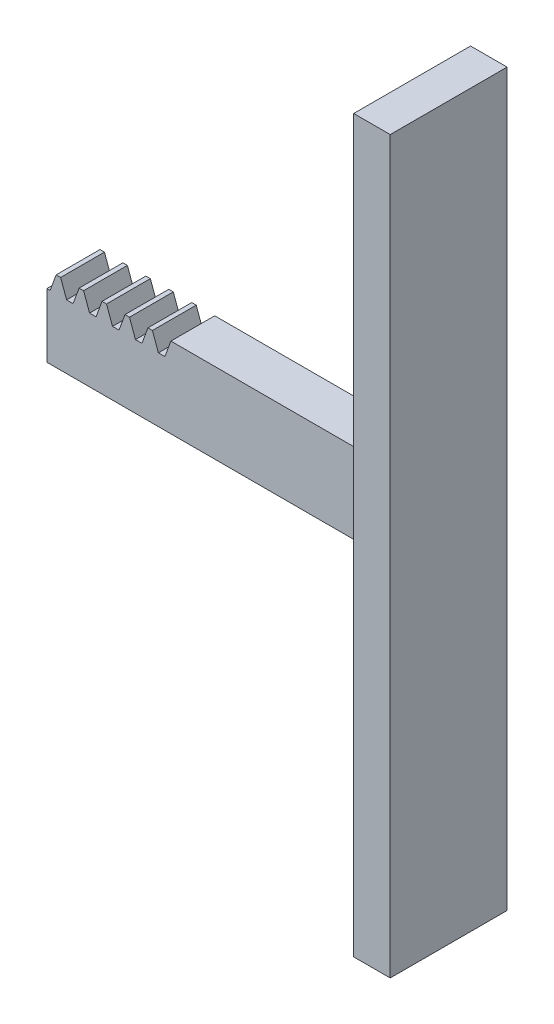
ISO-10303-21;
HEADER;
FILE_DESCRIPTION(('STEP AP214'),'2;1');
FILE_NAME('part.step','',(''),(''),'','','');
FILE_SCHEMA(('AUTOMOTIVE_DESIGN { 1 0 10303 214 1 1 1 1 }'));
ENDSEC;
DATA;
#1=APPLICATION_CONTEXT('core data for automotive mechanical design processes');
#2=APPLICATION_PROTOCOL_DEFINITION('international standard','automotive_design',2000,#1);
#3=PRODUCT_CONTEXT('',#1,'mechanical');
#4=PRODUCT('Part','Part','',(#3));
#5=PRODUCT_RELATED_PRODUCT_CATEGORY('part','',(#4));
#6=PRODUCT_DEFINITION_FORMATION('','',#4);
#7=PRODUCT_DEFINITION_CONTEXT('part definition',#1,'design');
#8=PRODUCT_DEFINITION('design','',#6,#7);
#9=PRODUCT_DEFINITION_SHAPE('','',#8);
#10=(LENGTH_UNIT() NAMED_UNIT(*) SI_UNIT(.MILLI.,.METRE.));
#11=(NAMED_UNIT(*) PLANE_ANGLE_UNIT() SI_UNIT($,.RADIAN.));
#12=(NAMED_UNIT(*) SI_UNIT($,.STERADIAN.) SOLID_ANGLE_UNIT());
#13=UNCERTAINTY_MEASURE_WITH_UNIT(LENGTH_MEASURE(1.E-05),#10,'distance_accuracy_value','');
#14=(GEOMETRIC_REPRESENTATION_CONTEXT(3) GLOBAL_UNCERTAINTY_ASSIGNED_CONTEXT((#13)) GLOBAL_UNIT_ASSIGNED_CONTEXT((#10,
#11,#12)) REPRESENTATION_CONTEXT('',''));
#15=CARTESIAN_POINT('',(0.,0.,0.));
#16=DIRECTION('',(0.,0.,1.));
#17=DIRECTION('',(1.,0.,0.));
#18=AXIS2_PLACEMENT_3D('',#15,#16,#17);
#19=CARTESIAN_POINT('',(0.,11.,-6.));
#20=DIRECTION('',(0.,1.,0.));
#21=DIRECTION('',(0.,0.,1.));
#22=AXIS2_PLACEMENT_3D('',#19,#20,#21);
#23=PLANE('',#22);
#24=DIRECTION('',(0.,0.,1.));
#25=VECTOR('',#24,1.);
#26=CARTESIAN_POINT('',(14.4445948532338,11.,-6.));
#27=LINE('',#26,#25);
#28=CARTESIAN_POINT('',(14.4445948532338,11.,-6.));
#29=VERTEX_POINT('',#28);
#30=CARTESIAN_POINT('',(14.4445948532338,11.,0.));
#31=VERTEX_POINT('',#30);
#32=EDGE_CURVE('E315',#29,#31,#27,.T.);
#33=ORIENTED_EDGE('',*,*,#32,.F.);
#34=DIRECTION('',(-1.,0.,0.));
#35=VECTOR('',#34,1.);
#36=CARTESIAN_POINT('',(0.,11.,-6.));
#37=LINE('',#36,#35);
#38=CARTESIAN_POINT('',(13.8297389967662,11.,-6.));
#39=VERTEX_POINT('',#38);
#40=EDGE_CURVE('E485',#29,#39,#37,.T.);
#41=ORIENTED_EDGE('',*,*,#40,.T.);
#42=DIRECTION('',(0.,0.,-1.));
#43=VECTOR('',#42,1.);
#44=CARTESIAN_POINT('',(13.8297389967662,11.,-6.));
#45=LINE('',#44,#43);
#46=CARTESIAN_POINT('',(13.8297389967662,11.,0.));
#47=VERTEX_POINT('',#46);
#48=EDGE_CURVE('E340',#47,#39,#45,.T.);
#49=ORIENTED_EDGE('',*,*,#48,.F.);
#50=DIRECTION('',(-1.,0.,0.));
#51=VECTOR('',#50,1.);
#52=CARTESIAN_POINT('',(0.,11.,0.));
#53=LINE('',#52,#51);
#54=EDGE_CURVE('E495',#31,#47,#53,.T.);
#55=ORIENTED_EDGE('',*,*,#54,.F.);
#56=EDGE_LOOP('',(#33,#41,#49,#55));
#57=FACE_BOUND('',#56,.T.);
#58=ADVANCED_FACE('F39',(#57),#23,.T.);
#59=DIRECTION('',(0.,0.,1.));
#60=VECTOR('',#59,1.);
#61=CARTESIAN_POINT('',(11.3030022032338,11.,-6.));
#62=LINE('',#61,#60);
#63=CARTESIAN_POINT('',(11.3030022032338,11.,-6.));
#64=VERTEX_POINT('',#63);
#65=CARTESIAN_POINT('',(11.3030022032338,11.,0.));
#66=VERTEX_POINT('',#65);
#67=EDGE_CURVE('E346',#64,#66,#62,.T.);
#68=ORIENTED_EDGE('',*,*,#67,.F.);
#69=CARTESIAN_POINT('',(10.6881463467662,11.,-6.));
#70=VERTEX_POINT('',#69);
#71=EDGE_CURVE('E563',#64,#70,#37,.T.);
#72=ORIENTED_EDGE('',*,*,#71,.T.);
#73=DIRECTION('',(0.,0.,-1.));
#74=VECTOR('',#73,1.);
#75=CARTESIAN_POINT('',(10.6881463467662,11.,-6.));
#76=LINE('',#75,#74);
#77=CARTESIAN_POINT('',(10.6881463467662,11.,0.));
#78=VERTEX_POINT('',#77);
#79=EDGE_CURVE('E373',#78,#70,#76,.T.);
#80=ORIENTED_EDGE('',*,*,#79,.F.);
#81=EDGE_CURVE('E522',#66,#78,#53,.T.);
#82=ORIENTED_EDGE('',*,*,#81,.F.);
#83=EDGE_LOOP('',(#68,#72,#80,#82));
#84=FACE_BOUND('',#83,.T.);
#85=ADVANCED_FACE('F528',(#84),#23,.T.);
#86=DIRECTION('',(0.,0.,1.));
#87=VECTOR('',#86,1.);
#88=CARTESIAN_POINT('',(8.1614095532338,11.,-6.));
#89=LINE('',#88,#87);
#90=CARTESIAN_POINT('',(8.1614095532338,11.,-6.));
#91=VERTEX_POINT('',#90);
#92=CARTESIAN_POINT('',(8.1614095532338,11.,0.));
#93=VERTEX_POINT('',#92);
#94=EDGE_CURVE('E379',#91,#93,#89,.T.);
#95=ORIENTED_EDGE('',*,*,#94,.F.);
#96=CARTESIAN_POINT('',(7.5465536967662,11.,-6.));
#97=VERTEX_POINT('',#96);
#98=EDGE_CURVE('E557',#91,#97,#37,.T.);
#99=ORIENTED_EDGE('',*,*,#98,.T.);
#100=DIRECTION('',(0.,0.,-1.));
#101=VECTOR('',#100,1.);
#102=CARTESIAN_POINT('',(7.5465536967662,11.,-6.));
#103=LINE('',#102,#101);
#104=CARTESIAN_POINT('',(7.5465536967662,11.,0.));
#105=VERTEX_POINT('',#104);
#106=EDGE_CURVE('E406',#105,#97,#103,.T.);
#107=ORIENTED_EDGE('',*,*,#106,.F.);
#108=EDGE_CURVE('E531',#93,#105,#53,.T.);
#109=ORIENTED_EDGE('',*,*,#108,.F.);
#110=EDGE_LOOP('',(#95,#99,#107,#109));
#111=FACE_BOUND('',#110,.T.);
#112=ADVANCED_FACE('F624',(#111),#23,.T.);
#113=DIRECTION('',(0.,0.,1.));
#114=VECTOR('',#113,1.);
#115=CARTESIAN_POINT('',(5.0198169032338,11.,-6.));
#116=LINE('',#115,#114);
#117=CARTESIAN_POINT('',(5.0198169032338,11.,-6.));
#118=VERTEX_POINT('',#117);
#119=CARTESIAN_POINT('',(5.0198169032338,11.,0.));
#120=VERTEX_POINT('',#119);
#121=EDGE_CURVE('E412',#118,#120,#116,.T.);
#122=ORIENTED_EDGE('',*,*,#121,.F.);
#123=CARTESIAN_POINT('',(4.4049610467662,11.,-6.));
#124=VERTEX_POINT('',#123);
#125=EDGE_CURVE('E555',#118,#124,#37,.T.);
#126=ORIENTED_EDGE('',*,*,#125,.T.);
#127=DIRECTION('',(0.,0.,-1.));
#128=VECTOR('',#127,1.);
#129=CARTESIAN_POINT('',(4.4049610467662,11.,-6.));
#130=LINE('',#129,#128);
#131=CARTESIAN_POINT('',(4.4049610467662,11.,0.));
#132=VERTEX_POINT('',#131);
#133=EDGE_CURVE('E439',#132,#124,#130,.T.);
#134=ORIENTED_EDGE('',*,*,#133,.F.);
#135=EDGE_CURVE('E534',#120,#132,#53,.T.);
#136=ORIENTED_EDGE('',*,*,#135,.F.);
#137=EDGE_LOOP('',(#122,#126,#134,#136));
#138=FACE_BOUND('',#137,.T.);
#139=ADVANCED_FACE('F632',(#138),#23,.T.);
#140=DIRECTION('',(0.,0.,1.));
#141=VECTOR('',#140,1.);
#142=CARTESIAN_POINT('',(1.8782242532338,11.,-6.));
#143=LINE('',#142,#141);
#144=CARTESIAN_POINT('',(1.8782242532338,11.,-6.));
#145=VERTEX_POINT('',#144);
#146=CARTESIAN_POINT('',(1.8782242532338,11.,0.));
#147=VERTEX_POINT('',#146);
#148=EDGE_CURVE('E445',#145,#147,#143,.T.);
#149=ORIENTED_EDGE('',*,*,#148,.F.);
#150=CARTESIAN_POINT('',(1.2633683967662,11.,-6.));
#151=VERTEX_POINT('',#150);
#152=EDGE_CURVE('E479',#145,#151,#37,.T.);
#153=ORIENTED_EDGE('',*,*,#152,.T.);
#154=DIRECTION('',(0.,0.,-1.));
#155=VECTOR('',#154,1.);
#156=CARTESIAN_POINT('',(1.2633683967662,11.,-6.));
#157=LINE('',#156,#155);
#158=CARTESIAN_POINT('',(1.2633683967662,11.,0.));
#159=VERTEX_POINT('',#158);
#160=EDGE_CURVE('E467',#159,#151,#157,.T.);
#161=ORIENTED_EDGE('',*,*,#160,.F.);
#162=EDGE_CURVE('E491',#147,#159,#53,.T.);
#163=ORIENTED_EDGE('',*,*,#162,.F.);
#164=EDGE_LOOP('',(#149,#153,#161,#163));
#165=FACE_BOUND('',#164,.T.);
#166=ADVANCED_FACE('F551',(#165),#23,.T.);
#167=CARTESIAN_POINT('',(0.,0.,-6.));
#168=DIRECTION('',(-1.,0.,0.));
#169=DIRECTION('',(0.,0.,1.));
#170=AXIS2_PLACEMENT_3D('',#167,#168,#169);
#171=PLANE('',#170);
#172=DIRECTION('',(0.,0.,1.));
#173=VECTOR('',#172,1.);
#174=CARTESIAN_POINT('',(0.,8.75,-6.));
#175=LINE('',#174,#173);
#176=CARTESIAN_POINT('',(0.,8.75,-6.));
#177=VERTEX_POINT('',#176);
#178=CARTESIAN_POINT('',(0.,8.75,0.));
#179=VERTEX_POINT('',#178);
#180=EDGE_CURVE('E464',#177,#179,#175,.T.);
#181=ORIENTED_EDGE('',*,*,#180,.F.);
#182=DIRECTION('',(0.,-1.,0.));
#183=VECTOR('',#182,1.);
#184=CARTESIAN_POINT('',(0.,0.,-6.));
#185=LINE('',#184,#183);
#186=CARTESIAN_POINT('',(0.,0.,-6.));
#187=VERTEX_POINT('',#186);
#188=EDGE_CURVE('E472',#177,#187,#185,.T.);
#189=ORIENTED_EDGE('',*,*,#188,.T.);
#190=DIRECTION('',(0.,0.,1.));
#191=VECTOR('',#190,1.);
#192=CARTESIAN_POINT('',(0.,0.,-6.));
#193=LINE('',#192,#191);
#194=CARTESIAN_POINT('',(0.,0.,0.));
#195=VERTEX_POINT('',#194);
#196=EDGE_CURVE('E484',#187,#195,#193,.T.);
#197=ORIENTED_EDGE('',*,*,#196,.T.);
#198=DIRECTION('',(0.,-1.,0.));
#199=VECTOR('',#198,1.);
#200=CARTESIAN_POINT('',(0.,0.,0.));
#201=LINE('',#200,#199);
#202=EDGE_CURVE('E471',#179,#195,#201,.T.);
#203=ORIENTED_EDGE('',*,*,#202,.F.);
#204=EDGE_LOOP('',(#181,#189,#197,#203));
#205=FACE_BOUND('',#204,.T.);
#206=ADVANCED_FACE('F41',(#205),#171,.T.);
#207=DIRECTION('',(0.,0.,-1.));
#208=VECTOR('',#207,1.);
#209=CARTESIAN_POINT('',(16.9713316467662,11.,-6.));
#210=LINE('',#209,#208);
#211=CARTESIAN_POINT('',(16.9713316467662,11.,0.));
#212=VERTEX_POINT('',#211);
#213=CARTESIAN_POINT('',(16.9713316467662,11.,-6.));
#214=VERTEX_POINT('',#213);
#215=EDGE_CURVE('E310',#212,#214,#210,.T.);
#216=ORIENTED_EDGE('',*,*,#215,.F.);
#217=CARTESIAN_POINT('',(47.,11.,0.));
#218=VERTEX_POINT('',#217);
#219=EDGE_CURVE('E476',#218,#212,#53,.T.);
#220=ORIENTED_EDGE('',*,*,#219,.F.);
#221=DIRECTION('',(0.,0.,1.));
#222=VECTOR('',#221,1.);
#223=CARTESIAN_POINT('',(47.,11.,0.));
#224=LINE('',#223,#222);
#225=CARTESIAN_POINT('',(47.,11.,-6.));
#226=VERTEX_POINT('',#225);
#227=EDGE_CURVE('E285',#226,#218,#224,.T.);
#228=ORIENTED_EDGE('',*,*,#227,.F.);
#229=EDGE_CURVE('E480',#226,#214,#37,.T.);
#230=ORIENTED_EDGE('',*,*,#229,.T.);
#231=EDGE_LOOP('',(#216,#220,#228,#230));
#232=FACE_BOUND('',#231,.T.);
#233=ADVANCED_FACE('F590',(#232),#23,.T.);
#234=CARTESIAN_POINT('',(0.,0.,-6.));
#235=DIRECTION('',(0.,-1.,0.));
#236=DIRECTION('',(0.,0.,-1.));
#237=AXIS2_PLACEMENT_3D('',#234,#235,#236);
#238=PLANE('',#237);
#239=DIRECTION('',(1.,0.,0.));
#240=VECTOR('',#239,1.);
#241=CARTESIAN_POINT('',(0.,0.,0.));
#242=LINE('',#241,#240);
#243=CARTESIAN_POINT('',(47.,0.,0.));
#244=VERTEX_POINT('',#243);
#245=EDGE_CURVE('E488',#195,#244,#242,.T.);
#246=ORIENTED_EDGE('',*,*,#245,.F.);
#247=ORIENTED_EDGE('',*,*,#196,.F.);
#248=DIRECTION('',(1.,0.,0.));
#249=VECTOR('',#248,1.);
#250=CARTESIAN_POINT('',(0.,0.,-6.));
#251=LINE('',#250,#249);
#252=CARTESIAN_POINT('',(47.,0.,-6.));
#253=VERTEX_POINT('',#252);
#254=EDGE_CURVE('E475',#187,#253,#251,.T.);
#255=ORIENTED_EDGE('',*,*,#254,.T.);
#256=DIRECTION('',(0.,0.,-1.));
#257=VECTOR('',#256,1.);
#258=CARTESIAN_POINT('',(47.,0.,0.));
#259=LINE('',#258,#257);
#260=EDGE_CURVE('E272',#244,#253,#259,.T.);
#261=ORIENTED_EDGE('',*,*,#260,.F.);
#262=EDGE_LOOP('',(#246,#247,#255,#261));
#263=FACE_BOUND('',#262,.T.);
#264=ADVANCED_FACE('F601',(#263),#238,.T.);
#265=CARTESIAN_POINT('',(0.,11.,-6.));
#266=DIRECTION('',(0.,0.,-1.));
#267=DIRECTION('',(-1.,0.,0.));
#268=AXIS2_PLACEMENT_3D('',#265,#266,#267);
#269=PLANE('',#268);
#270=DIRECTION('',(0.342020143325663,-0.939692620785911,0.));
#271=VECTOR('',#270,1.);
#272=CARTESIAN_POINT('',(14.4353500092834,11.0254,-6.));
#273=LINE('',#272,#271);
#274=CARTESIAN_POINT('',(15.2635278803327,8.75,-6.));
#275=VERTEX_POINT('',#274);
#276=EDGE_CURVE('E290',#29,#275,#273,.T.);
#277=ORIENTED_EDGE('',*,*,#276,.T.);
#278=DIRECTION('',(1.,0.,0.));
#279=VECTOR('',#278,1.);
#280=CARTESIAN_POINT('',(16.1523986196673,8.75,-6.));
#281=LINE('',#280,#279);
#282=CARTESIAN_POINT('',(16.1523986196673,8.75,-6.));
#283=VERTEX_POINT('',#282);
#284=EDGE_CURVE('E294',#275,#283,#281,.T.);
#285=ORIENTED_EDGE('',*,*,#284,.T.);
#286=DIRECTION('',(0.342020143325663,0.939692620785911,0.));
#287=VECTOR('',#286,1.);
#288=CARTESIAN_POINT('',(16.9805764907166,11.0254,-6.));
#289=LINE('',#288,#287);
#290=EDGE_CURVE('E299',#283,#214,#289,.T.);
#291=ORIENTED_EDGE('',*,*,#290,.T.);
#292=ORIENTED_EDGE('',*,*,#229,.F.);
#293=DIRECTION('',(0.,1.,0.));
#294=VECTOR('',#293,1.);
#295=CARTESIAN_POINT('',(47.,11.,-6.));
#296=LINE('',#295,#294);
#297=EDGE_CURVE('E281',#253,#226,#296,.T.);
#298=ORIENTED_EDGE('',*,*,#297,.F.);
#299=ORIENTED_EDGE('',*,*,#254,.F.);
#300=ORIENTED_EDGE('',*,*,#188,.F.);
#301=DIRECTION('',(1.,0.,0.));
#302=VECTOR('',#301,1.);
#303=CARTESIAN_POINT('',(0.444435369667258,8.75,-6.));
#304=LINE('',#303,#302);
#305=CARTESIAN_POINT('',(0.444435369667258,8.75,-6.));
#306=VERTEX_POINT('',#305);
#307=EDGE_CURVE('E449',#177,#306,#304,.T.);
#308=ORIENTED_EDGE('',*,*,#307,.T.);
#309=DIRECTION('',(0.342020143325663,0.939692620785911,0.));
#310=VECTOR('',#309,1.);
#311=CARTESIAN_POINT('',(1.27261324071656,11.0254,-6.));
#312=LINE('',#311,#310);
#313=EDGE_CURVE('E453',#306,#151,#312,.T.);
#314=ORIENTED_EDGE('',*,*,#313,.T.);
#315=ORIENTED_EDGE('',*,*,#152,.F.);
#316=DIRECTION('',(0.342020143325663,-0.939692620785911,0.));
#317=VECTOR('',#316,1.);
#318=CARTESIAN_POINT('',(1.86897940928344,11.0254,-6.));
#319=LINE('',#318,#317);
#320=CARTESIAN_POINT('',(2.69715728033274,8.75,-6.));
#321=VERTEX_POINT('',#320);
#322=EDGE_CURVE('E416',#145,#321,#319,.T.);
#323=ORIENTED_EDGE('',*,*,#322,.T.);
#324=DIRECTION('',(1.,0.,0.));
#325=VECTOR('',#324,1.);
#326=CARTESIAN_POINT('',(3.58602801966726,8.75,-6.));
#327=LINE('',#326,#325);
#328=CARTESIAN_POINT('',(3.58602801966726,8.75,-6.));
#329=VERTEX_POINT('',#328);
#330=EDGE_CURVE('E420',#321,#329,#327,.T.);
#331=ORIENTED_EDGE('',*,*,#330,.T.);
#332=DIRECTION('',(0.342020143325663,0.939692620785911,0.));
#333=VECTOR('',#332,1.);
#334=CARTESIAN_POINT('',(4.41420589071656,11.0254,-6.));
#335=LINE('',#334,#333);
#336=EDGE_CURVE('E425',#329,#124,#335,.T.);
#337=ORIENTED_EDGE('',*,*,#336,.T.);
#338=ORIENTED_EDGE('',*,*,#125,.F.);
#339=DIRECTION('',(0.342020143325663,-0.939692620785911,0.));
#340=VECTOR('',#339,1.);
#341=CARTESIAN_POINT('',(5.01057205928344,11.0254,-6.));
#342=LINE('',#341,#340);
#343=CARTESIAN_POINT('',(5.83874993033274,8.75,-6.));
#344=VERTEX_POINT('',#343);
#345=EDGE_CURVE('E383',#118,#344,#342,.T.);
#346=ORIENTED_EDGE('',*,*,#345,.T.);
#347=DIRECTION('',(1.,0.,0.));
#348=VECTOR('',#347,1.);
#349=CARTESIAN_POINT('',(6.72762066966726,8.75,-6.));
#350=LINE('',#349,#348);
#351=CARTESIAN_POINT('',(6.72762066966726,8.75,-6.));
#352=VERTEX_POINT('',#351);
#353=EDGE_CURVE('E387',#344,#352,#350,.T.);
#354=ORIENTED_EDGE('',*,*,#353,.T.);
#355=DIRECTION('',(0.342020143325663,0.939692620785911,0.));
#356=VECTOR('',#355,1.);
#357=CARTESIAN_POINT('',(7.55579854071656,11.0254,-6.));
#358=LINE('',#357,#356);
#359=EDGE_CURVE('E392',#352,#97,#358,.T.);
#360=ORIENTED_EDGE('',*,*,#359,.T.);
#361=ORIENTED_EDGE('',*,*,#98,.F.);
#362=DIRECTION('',(0.342020143325663,-0.939692620785911,0.));
#363=VECTOR('',#362,1.);
#364=CARTESIAN_POINT('',(8.15216470928344,11.0254,-6.));
#365=LINE('',#364,#363);
#366=CARTESIAN_POINT('',(8.98034258033274,8.75,-6.));
#367=VERTEX_POINT('',#366);
#368=EDGE_CURVE('E350',#91,#367,#365,.T.);
#369=ORIENTED_EDGE('',*,*,#368,.T.);
#370=DIRECTION('',(1.,0.,0.));
#371=VECTOR('',#370,1.);
#372=CARTESIAN_POINT('',(9.86921331966726,8.75,-6.));
#373=LINE('',#372,#371);
#374=CARTESIAN_POINT('',(9.86921331966726,8.75,-6.));
#375=VERTEX_POINT('',#374);
#376=EDGE_CURVE('E354',#367,#375,#373,.T.);
#377=ORIENTED_EDGE('',*,*,#376,.T.);
#378=DIRECTION('',(0.342020143325663,0.939692620785911,0.));
#379=VECTOR('',#378,1.);
#380=CARTESIAN_POINT('',(10.6973911907166,11.0254,-6.));
#381=LINE('',#380,#379);
#382=EDGE_CURVE('E359',#375,#70,#381,.T.);
#383=ORIENTED_EDGE('',*,*,#382,.T.);
#384=ORIENTED_EDGE('',*,*,#71,.F.);
#385=DIRECTION('',(0.342020143325663,-0.939692620785911,0.));
#386=VECTOR('',#385,1.);
#387=CARTESIAN_POINT('',(11.2937573592834,11.0254,-6.));
#388=LINE('',#387,#386);
#389=CARTESIAN_POINT('',(12.1219352303327,8.75,-6.));
#390=VERTEX_POINT('',#389);
#391=EDGE_CURVE('E319',#64,#390,#388,.T.);
#392=ORIENTED_EDGE('',*,*,#391,.T.);
#393=DIRECTION('',(1.,0.,0.));
#394=VECTOR('',#393,1.);
#395=CARTESIAN_POINT('',(13.0108059696673,8.75,-6.));
#396=LINE('',#395,#394);
#397=CARTESIAN_POINT('',(13.0108059696673,8.75,-6.));
#398=VERTEX_POINT('',#397);
#399=EDGE_CURVE('E323',#390,#398,#396,.T.);
#400=ORIENTED_EDGE('',*,*,#399,.T.);
#401=DIRECTION('',(0.342020143325663,0.939692620785911,0.));
#402=VECTOR('',#401,1.);
#403=CARTESIAN_POINT('',(13.8389838407166,11.0254,-6.));
#404=LINE('',#403,#402);
#405=EDGE_CURVE('E328',#398,#39,#404,.T.);
#406=ORIENTED_EDGE('',*,*,#405,.T.);
#407=ORIENTED_EDGE('',*,*,#40,.F.);
#408=EDGE_LOOP('',(#277,#285,#291,#292,#298,#299,#300,#308,#314,#315,#323,#331,#337,#338,#346,
#354,#360,#361,#369,#377,#383,#384,#392,#400,#406,#407));
#409=FACE_BOUND('',#408,.T.);
#410=ADVANCED_FACE('F578',(#409),#269,.T.);
#411=CARTESIAN_POINT('',(0.,11.,0.));
#412=DIRECTION('',(0.,0.,-1.));
#413=DIRECTION('',(-1.,0.,0.));
#414=AXIS2_PLACEMENT_3D('',#411,#412,#413);
#415=PLANE('',#414);
#416=DIRECTION('',(1.,0.,0.));
#417=VECTOR('',#416,1.);
#418=CARTESIAN_POINT('',(16.1523986196673,8.75,0.));
#419=LINE('',#418,#417);
#420=CARTESIAN_POINT('',(15.2635278803327,8.75,0.));
#421=VERTEX_POINT('',#420);
#422=CARTESIAN_POINT('',(16.1523986196673,8.75,0.));
#423=VERTEX_POINT('',#422);
#424=EDGE_CURVE('E289',#421,#423,#419,.T.);
#425=ORIENTED_EDGE('',*,*,#424,.F.);
#426=DIRECTION('',(-0.342020143325663,0.939692620785911,0.));
#427=VECTOR('',#426,1.);
#428=CARTESIAN_POINT('',(12.7548982368293,15.6424032993003,0.));
#429=LINE('',#428,#427);
#430=EDGE_CURVE('E11',#421,#31,#429,.T.);
#431=ORIENTED_EDGE('',*,*,#430,.T.);
#432=ORIENTED_EDGE('',*,*,#54,.T.);
#433=DIRECTION('',(0.342020143325663,0.939692620785911,0.));
#434=VECTOR('',#433,1.);
#435=CARTESIAN_POINT('',(13.8389838407166,11.0254,0.));
#436=LINE('',#435,#434);
#437=CARTESIAN_POINT('',(13.0108059696673,8.75,0.));
#438=VERTEX_POINT('',#437);
#439=EDGE_CURVE('E324',#438,#47,#436,.T.);
#440=ORIENTED_EDGE('',*,*,#439,.F.);
#441=DIRECTION('',(1.,0.,0.));
#442=VECTOR('',#441,1.);
#443=CARTESIAN_POINT('',(13.0108059696673,8.75,0.));
#444=LINE('',#443,#442);
#445=CARTESIAN_POINT('',(12.1219352303327,8.75,0.));
#446=VERTEX_POINT('',#445);
#447=EDGE_CURVE('E318',#446,#438,#444,.T.);
#448=ORIENTED_EDGE('',*,*,#447,.F.);
#449=DIRECTION('',(-0.342020143325663,0.939692620785911,0.));
#450=VECTOR('',#449,1.);
#451=CARTESIAN_POINT('',(9.98080211579136,14.6327148842491,0.));
#452=LINE('',#451,#450);
#453=EDGE_CURVE('E48',#446,#66,#452,.T.);
#454=ORIENTED_EDGE('',*,*,#453,.T.);
#455=ORIENTED_EDGE('',*,*,#81,.T.);
#456=DIRECTION('',(0.342020143325663,0.939692620785911,0.));
#457=VECTOR('',#456,1.);
#458=CARTESIAN_POINT('',(10.6973911907166,11.0254,0.));
#459=LINE('',#458,#457);
#460=CARTESIAN_POINT('',(9.86921331966726,8.75,0.));
#461=VERTEX_POINT('',#460);
#462=EDGE_CURVE('E355',#461,#78,#459,.T.);
#463=ORIENTED_EDGE('',*,*,#462,.F.);
#464=DIRECTION('',(1.,0.,0.));
#465=VECTOR('',#464,1.);
#466=CARTESIAN_POINT('',(9.86921331966726,8.75,0.));
#467=LINE('',#466,#465);
#468=CARTESIAN_POINT('',(8.98034258033274,8.75,0.));
#469=VERTEX_POINT('',#468);
#470=EDGE_CURVE('E349',#469,#461,#467,.T.);
#471=ORIENTED_EDGE('',*,*,#470,.F.);
#472=DIRECTION('',(-0.342020143325663,0.939692620785911,0.));
#473=VECTOR('',#472,1.);
#474=CARTESIAN_POINT('',(7.20670599475338,13.623026469198,0.));
#475=LINE('',#474,#473);
#476=EDGE_CURVE('E511',#469,#93,#475,.T.);
#477=ORIENTED_EDGE('',*,*,#476,.T.);
#478=ORIENTED_EDGE('',*,*,#108,.T.);
#479=DIRECTION('',(0.342020143325663,0.939692620785911,0.));
#480=VECTOR('',#479,1.);
#481=CARTESIAN_POINT('',(7.55579854071656,11.0254,0.));
#482=LINE('',#481,#480);
#483=CARTESIAN_POINT('',(6.72762066966726,8.75,0.));
#484=VERTEX_POINT('',#483);
#485=EDGE_CURVE('E388',#484,#105,#482,.T.);
#486=ORIENTED_EDGE('',*,*,#485,.F.);
#487=DIRECTION('',(1.,0.,0.));
#488=VECTOR('',#487,1.);
#489=CARTESIAN_POINT('',(6.72762066966726,8.75,0.));
#490=LINE('',#489,#488);
#491=CARTESIAN_POINT('',(5.83874993033274,8.75,0.));
#492=VERTEX_POINT('',#491);
#493=EDGE_CURVE('E382',#492,#484,#490,.T.);
#494=ORIENTED_EDGE('',*,*,#493,.F.);
#495=DIRECTION('',(-0.342020143325663,0.939692620785911,0.));
#496=VECTOR('',#495,1.);
#497=CARTESIAN_POINT('',(4.43260987371541,12.6133380541468,0.));
#498=LINE('',#497,#496);
#499=EDGE_CURVE('E507',#492,#120,#498,.T.);
#500=ORIENTED_EDGE('',*,*,#499,.T.);
#501=ORIENTED_EDGE('',*,*,#135,.T.);
#502=DIRECTION('',(0.342020143325663,0.939692620785911,0.));
#503=VECTOR('',#502,1.);
#504=CARTESIAN_POINT('',(4.41420589071656,11.0254,0.));
#505=LINE('',#504,#503);
#506=CARTESIAN_POINT('',(3.58602801966726,8.75,0.));
#507=VERTEX_POINT('',#506);
#508=EDGE_CURVE('E421',#507,#132,#505,.T.);
#509=ORIENTED_EDGE('',*,*,#508,.F.);
#510=DIRECTION('',(1.,0.,0.));
#511=VECTOR('',#510,1.);
#512=CARTESIAN_POINT('',(3.58602801966726,8.75,0.));
#513=LINE('',#512,#511);
#514=CARTESIAN_POINT('',(2.69715728033274,8.75,0.));
#515=VERTEX_POINT('',#514);
#516=EDGE_CURVE('E415',#515,#507,#513,.T.);
#517=ORIENTED_EDGE('',*,*,#516,.F.);
#518=DIRECTION('',(-0.342020143325663,0.939692620785911,0.));
#519=VECTOR('',#518,1.);
#520=CARTESIAN_POINT('',(1.65851375267743,11.6036496390957,0.));
#521=LINE('',#520,#519);
#522=EDGE_CURVE('E503',#515,#147,#521,.T.);
#523=ORIENTED_EDGE('',*,*,#522,.T.);
#524=ORIENTED_EDGE('',*,*,#162,.T.);
#525=DIRECTION('',(0.342020143325663,0.939692620785911,0.));
#526=VECTOR('',#525,1.);
#527=CARTESIAN_POINT('',(1.27261324071656,11.0254,0.));
#528=LINE('',#527,#526);
#529=CARTESIAN_POINT('',(0.444435369667258,8.75,0.));
#530=VERTEX_POINT('',#529);
#531=EDGE_CURVE('E448',#530,#159,#528,.T.);
#532=ORIENTED_EDGE('',*,*,#531,.F.);
#533=DIRECTION('',(-1.,0.,0.));
#534=VECTOR('',#533,1.);
#535=CARTESIAN_POINT('',(0.,8.75,0.));
#536=LINE('',#535,#534);
#537=EDGE_CURVE('E499',#530,#179,#536,.T.);
#538=ORIENTED_EDGE('',*,*,#537,.T.);
#539=ORIENTED_EDGE('',*,*,#202,.T.);
#540=ORIENTED_EDGE('',*,*,#245,.T.);
#541=DIRECTION('',(0.,-1.,0.));
#542=VECTOR('',#541,1.);
#543=CARTESIAN_POINT('',(47.,11.,0.));
#544=LINE('',#543,#542);
#545=EDGE_CURVE('E267',#218,#244,#544,.T.);
#546=ORIENTED_EDGE('',*,*,#545,.F.);
#547=ORIENTED_EDGE('',*,*,#219,.T.);
#548=DIRECTION('',(0.342020143325663,0.939692620785911,0.));
#549=VECTOR('',#548,1.);
#550=CARTESIAN_POINT('',(16.9805764907166,11.0254,0.));
#551=LINE('',#550,#549);
#552=EDGE_CURVE('E295',#423,#212,#551,.T.);
#553=ORIENTED_EDGE('',*,*,#552,.F.);
#554=EDGE_LOOP('',(#425,#431,#432,#440,#448,#454,#455,#463,#471,#477,#478,#486,#494,#500,#501,
#509,#517,#523,#524,#532,#538,#539,#540,#546,#547,#553));
#555=FACE_BOUND('',#554,.T.);
#556=ADVANCED_FACE('F520',(#555),#415,.F.);
#557=CARTESIAN_POINT('',(1.27261324071656,11.0254,-6.));
#558=DIRECTION('',(0.939692620785911,-0.342020143325663,0.));
#559=DIRECTION('',(0.342020143325663,0.939692620785911,0.));
#560=AXIS2_PLACEMENT_3D('',#557,#558,#559);
#561=PLANE('',#560);
#562=ORIENTED_EDGE('',*,*,#160,.T.);
#563=ORIENTED_EDGE('',*,*,#313,.F.);
#564=DIRECTION('',(0.,0.,1.));
#565=VECTOR('',#564,1.);
#566=CARTESIAN_POINT('',(0.444435369667258,8.75,-6.));
#567=LINE('',#566,#565);
#568=EDGE_CURVE('E457',#306,#530,#567,.T.);
#569=ORIENTED_EDGE('',*,*,#568,.T.);
#570=ORIENTED_EDGE('',*,*,#531,.T.);
#571=EDGE_LOOP('',(#562,#563,#569,#570));
#572=FACE_BOUND('',#571,.T.);
#573=ADVANCED_FACE('F549',(#572),#561,.F.);
#574=CARTESIAN_POINT('',(0.444435369667258,8.75,-6.));
#575=DIRECTION('',(0.,-1.,0.));
#576=DIRECTION('',(0.,0.,-1.));
#577=AXIS2_PLACEMENT_3D('',#574,#575,#576);
#578=PLANE('',#577);
#579=ORIENTED_EDGE('',*,*,#180,.T.);
#580=ORIENTED_EDGE('',*,*,#537,.F.);
#581=ORIENTED_EDGE('',*,*,#568,.F.);
#582=ORIENTED_EDGE('',*,*,#307,.F.);
#583=EDGE_LOOP('',(#579,#580,#581,#582));
#584=FACE_BOUND('',#583,.T.);
#585=ADVANCED_FACE('F606',(#584),#578,.F.);
#586=CARTESIAN_POINT('',(1.86897940928344,11.0254,-6.));
#587=DIRECTION('',(-0.939692620785911,-0.342020143325663,0.));
#588=DIRECTION('',(0.342020143325663,-0.939692620785911,0.));
#589=AXIS2_PLACEMENT_3D('',#586,#587,#588);
#590=PLANE('',#589);
#591=ORIENTED_EDGE('',*,*,#148,.T.);
#592=ORIENTED_EDGE('',*,*,#522,.F.);
#593=DIRECTION('',(0.,0.,1.));
#594=VECTOR('',#593,1.);
#595=CARTESIAN_POINT('',(2.69715728033274,8.75,-6.));
#596=LINE('',#595,#594);
#597=EDGE_CURVE('E429',#321,#515,#596,.T.);
#598=ORIENTED_EDGE('',*,*,#597,.F.);
#599=ORIENTED_EDGE('',*,*,#322,.F.);
#600=EDGE_LOOP('',(#591,#592,#598,#599));
#601=FACE_BOUND('',#600,.T.);
#602=ADVANCED_FACE('F608',(#601),#590,.F.);
#603=CARTESIAN_POINT('',(4.41420589071656,11.0254,-6.));
#604=DIRECTION('',(0.939692620785911,-0.342020143325663,0.));
#605=DIRECTION('',(0.342020143325663,0.939692620785911,0.));
#606=AXIS2_PLACEMENT_3D('',#603,#604,#605);
#607=PLANE('',#606);
#608=ORIENTED_EDGE('',*,*,#133,.T.);
#609=ORIENTED_EDGE('',*,*,#336,.F.);
#610=DIRECTION('',(0.,0.,1.));
#611=VECTOR('',#610,1.);
#612=CARTESIAN_POINT('',(3.58602801966726,8.75,-6.));
#613=LINE('',#612,#611);
#614=EDGE_CURVE('E436',#329,#507,#613,.T.);
#615=ORIENTED_EDGE('',*,*,#614,.T.);
#616=ORIENTED_EDGE('',*,*,#508,.T.);
#617=EDGE_LOOP('',(#608,#609,#615,#616));
#618=FACE_BOUND('',#617,.T.);
#619=ADVANCED_FACE('F614',(#618),#607,.F.);
#620=CARTESIAN_POINT('',(3.58602801966726,8.75,-6.));
#621=DIRECTION('',(0.,-1.,0.));
#622=DIRECTION('',(0.,0.,-1.));
#623=AXIS2_PLACEMENT_3D('',#620,#621,#622);
#624=PLANE('',#623);
#625=ORIENTED_EDGE('',*,*,#516,.T.);
#626=ORIENTED_EDGE('',*,*,#614,.F.);
#627=ORIENTED_EDGE('',*,*,#330,.F.);
#628=ORIENTED_EDGE('',*,*,#597,.T.);
#629=EDGE_LOOP('',(#625,#626,#627,#628));
#630=FACE_BOUND('',#629,.T.);
#631=ADVANCED_FACE('F645',(#630),#624,.F.);
#632=CARTESIAN_POINT('',(5.01057205928344,11.0254,-6.));
#633=DIRECTION('',(-0.939692620785911,-0.342020143325663,0.));
#634=DIRECTION('',(0.342020143325663,-0.939692620785911,0.));
#635=AXIS2_PLACEMENT_3D('',#632,#633,#634);
#636=PLANE('',#635);
#637=ORIENTED_EDGE('',*,*,#121,.T.);
#638=ORIENTED_EDGE('',*,*,#499,.F.);
#639=DIRECTION('',(0.,0.,1.));
#640=VECTOR('',#639,1.);
#641=CARTESIAN_POINT('',(5.83874993033274,8.75,-6.));
#642=LINE('',#641,#640);
#643=EDGE_CURVE('E396',#344,#492,#642,.T.);
#644=ORIENTED_EDGE('',*,*,#643,.F.);
#645=ORIENTED_EDGE('',*,*,#345,.F.);
#646=EDGE_LOOP('',(#637,#638,#644,#645));
#647=FACE_BOUND('',#646,.T.);
#648=ADVANCED_FACE('F647',(#647),#636,.F.);
#649=CARTESIAN_POINT('',(7.55579854071656,11.0254,-6.));
#650=DIRECTION('',(0.939692620785911,-0.342020143325663,0.));
#651=DIRECTION('',(0.342020143325663,0.939692620785911,0.));
#652=AXIS2_PLACEMENT_3D('',#649,#650,#651);
#653=PLANE('',#652);
#654=ORIENTED_EDGE('',*,*,#106,.T.);
#655=ORIENTED_EDGE('',*,*,#359,.F.);
#656=DIRECTION('',(0.,0.,1.));
#657=VECTOR('',#656,1.);
#658=CARTESIAN_POINT('',(6.72762066966726,8.75,-6.));
#659=LINE('',#658,#657);
#660=EDGE_CURVE('E403',#352,#484,#659,.T.);
#661=ORIENTED_EDGE('',*,*,#660,.T.);
#662=ORIENTED_EDGE('',*,*,#485,.T.);
#663=EDGE_LOOP('',(#654,#655,#661,#662));
#664=FACE_BOUND('',#663,.T.);
#665=ADVANCED_FACE('F653',(#664),#653,.F.);
#666=CARTESIAN_POINT('',(6.72762066966726,8.75,-6.));
#667=DIRECTION('',(0.,-1.,0.));
#668=DIRECTION('',(0.,0.,-1.));
#669=AXIS2_PLACEMENT_3D('',#666,#667,#668);
#670=PLANE('',#669);
#671=ORIENTED_EDGE('',*,*,#493,.T.);
#672=ORIENTED_EDGE('',*,*,#660,.F.);
#673=ORIENTED_EDGE('',*,*,#353,.F.);
#674=ORIENTED_EDGE('',*,*,#643,.T.);
#675=EDGE_LOOP('',(#671,#672,#673,#674));
#676=FACE_BOUND('',#675,.T.);
#677=ADVANCED_FACE('F657',(#676),#670,.F.);
#678=CARTESIAN_POINT('',(8.15216470928344,11.0254,-6.));
#679=DIRECTION('',(-0.939692620785911,-0.342020143325663,0.));
#680=DIRECTION('',(0.342020143325663,-0.939692620785911,0.));
#681=AXIS2_PLACEMENT_3D('',#678,#679,#680);
#682=PLANE('',#681);
#683=ORIENTED_EDGE('',*,*,#94,.T.);
#684=ORIENTED_EDGE('',*,*,#476,.F.);
#685=DIRECTION('',(0.,0.,1.));
#686=VECTOR('',#685,1.);
#687=CARTESIAN_POINT('',(8.98034258033274,8.75,-6.));
#688=LINE('',#687,#686);
#689=EDGE_CURVE('E363',#367,#469,#688,.T.);
#690=ORIENTED_EDGE('',*,*,#689,.F.);
#691=ORIENTED_EDGE('',*,*,#368,.F.);
#692=EDGE_LOOP('',(#683,#684,#690,#691));
#693=FACE_BOUND('',#692,.T.);
#694=ADVANCED_FACE('F660',(#693),#682,.F.);
#695=CARTESIAN_POINT('',(10.6973911907166,11.0254,-6.));
#696=DIRECTION('',(0.939692620785911,-0.342020143325663,0.));
#697=DIRECTION('',(0.342020143325663,0.939692620785911,0.));
#698=AXIS2_PLACEMENT_3D('',#695,#696,#697);
#699=PLANE('',#698);
#700=ORIENTED_EDGE('',*,*,#79,.T.);
#701=ORIENTED_EDGE('',*,*,#382,.F.);
#702=DIRECTION('',(0.,0.,1.));
#703=VECTOR('',#702,1.);
#704=CARTESIAN_POINT('',(9.86921331966726,8.75,-6.));
#705=LINE('',#704,#703);
#706=EDGE_CURVE('E370',#375,#461,#705,.T.);
#707=ORIENTED_EDGE('',*,*,#706,.T.);
#708=ORIENTED_EDGE('',*,*,#462,.T.);
#709=EDGE_LOOP('',(#700,#701,#707,#708));
#710=FACE_BOUND('',#709,.T.);
#711=ADVANCED_FACE('F667',(#710),#699,.F.);
#712=CARTESIAN_POINT('',(9.86921331966726,8.75,-6.));
#713=DIRECTION('',(0.,-1.,0.));
#714=DIRECTION('',(0.,0.,-1.));
#715=AXIS2_PLACEMENT_3D('',#712,#713,#714);
#716=PLANE('',#715);
#717=ORIENTED_EDGE('',*,*,#470,.T.);
#718=ORIENTED_EDGE('',*,*,#706,.F.);
#719=ORIENTED_EDGE('',*,*,#376,.F.);
#720=ORIENTED_EDGE('',*,*,#689,.T.);
#721=EDGE_LOOP('',(#717,#718,#719,#720));
#722=FACE_BOUND('',#721,.T.);
#723=ADVANCED_FACE('F669',(#722),#716,.F.);
#724=CARTESIAN_POINT('',(11.2937573592834,11.0254,-6.));
#725=DIRECTION('',(-0.939692620785911,-0.342020143325663,0.));
#726=DIRECTION('',(0.342020143325663,-0.939692620785911,0.));
#727=AXIS2_PLACEMENT_3D('',#724,#725,#726);
#728=PLANE('',#727);
#729=ORIENTED_EDGE('',*,*,#67,.T.);
#730=ORIENTED_EDGE('',*,*,#453,.F.);
#731=DIRECTION('',(0.,0.,1.));
#732=VECTOR('',#731,1.);
#733=CARTESIAN_POINT('',(12.1219352303327,8.75,-6.));
#734=LINE('',#733,#732);
#735=EDGE_CURVE('E63',#390,#446,#734,.T.);
#736=ORIENTED_EDGE('',*,*,#735,.F.);
#737=ORIENTED_EDGE('',*,*,#391,.F.);
#738=EDGE_LOOP('',(#729,#730,#736,#737));
#739=FACE_BOUND('',#738,.T.);
#740=ADVANCED_FACE('F672',(#739),#728,.F.);
#741=CARTESIAN_POINT('',(13.8389838407166,11.0254,-6.));
#742=DIRECTION('',(0.939692620785911,-0.342020143325663,0.));
#743=DIRECTION('',(0.342020143325663,0.939692620785911,0.));
#744=AXIS2_PLACEMENT_3D('',#741,#742,#743);
#745=PLANE('',#744);
#746=ORIENTED_EDGE('',*,*,#48,.T.);
#747=ORIENTED_EDGE('',*,*,#405,.F.);
#748=DIRECTION('',(0.,0.,1.));
#749=VECTOR('',#748,1.);
#750=CARTESIAN_POINT('',(13.0108059696673,8.75,-6.));
#751=LINE('',#750,#749);
#752=EDGE_CURVE('E337',#398,#438,#751,.T.);
#753=ORIENTED_EDGE('',*,*,#752,.T.);
#754=ORIENTED_EDGE('',*,*,#439,.T.);
#755=EDGE_LOOP('',(#746,#747,#753,#754));
#756=FACE_BOUND('',#755,.T.);
#757=ADVANCED_FACE('F577',(#756),#745,.F.);
#758=CARTESIAN_POINT('',(13.0108059696673,8.75,-6.));
#759=DIRECTION('',(0.,-1.,0.));
#760=DIRECTION('',(0.,0.,-1.));
#761=AXIS2_PLACEMENT_3D('',#758,#759,#760);
#762=PLANE('',#761);
#763=ORIENTED_EDGE('',*,*,#447,.T.);
#764=ORIENTED_EDGE('',*,*,#752,.F.);
#765=ORIENTED_EDGE('',*,*,#399,.F.);
#766=ORIENTED_EDGE('',*,*,#735,.T.);
#767=EDGE_LOOP('',(#763,#764,#765,#766));
#768=FACE_BOUND('',#767,.T.);
#769=ADVANCED_FACE('F579',(#768),#762,.F.);
#770=CARTESIAN_POINT('',(14.4353500092834,11.0254,-6.));
#771=DIRECTION('',(-0.939692620785911,-0.342020143325663,0.));
#772=DIRECTION('',(0.342020143325663,-0.939692620785911,0.));
#773=AXIS2_PLACEMENT_3D('',#770,#771,#772);
#774=PLANE('',#773);
#775=ORIENTED_EDGE('',*,*,#32,.T.);
#776=ORIENTED_EDGE('',*,*,#430,.F.);
#777=DIRECTION('',(0.,0.,1.));
#778=VECTOR('',#777,1.);
#779=CARTESIAN_POINT('',(15.2635278803327,8.75,-6.));
#780=LINE('',#779,#778);
#781=EDGE_CURVE('E55',#275,#421,#780,.T.);
#782=ORIENTED_EDGE('',*,*,#781,.F.);
#783=ORIENTED_EDGE('',*,*,#276,.F.);
#784=EDGE_LOOP('',(#775,#776,#782,#783));
#785=FACE_BOUND('',#784,.T.);
#786=ADVANCED_FACE('F582',(#785),#774,.F.);
#787=CARTESIAN_POINT('',(16.9805764907166,11.0254,-6.));
#788=DIRECTION('',(0.939692620785911,-0.342020143325663,0.));
#789=DIRECTION('',(0.342020143325663,0.939692620785911,0.));
#790=AXIS2_PLACEMENT_3D('',#787,#788,#789);
#791=PLANE('',#790);
#792=ORIENTED_EDGE('',*,*,#215,.T.);
#793=ORIENTED_EDGE('',*,*,#290,.F.);
#794=DIRECTION('',(0.,0.,1.));
#795=VECTOR('',#794,1.);
#796=CARTESIAN_POINT('',(16.1523986196673,8.75,-6.));
#797=LINE('',#796,#795);
#798=EDGE_CURVE('E307',#283,#423,#797,.T.);
#799=ORIENTED_EDGE('',*,*,#798,.T.);
#800=ORIENTED_EDGE('',*,*,#552,.T.);
#801=EDGE_LOOP('',(#792,#793,#799,#800));
#802=FACE_BOUND('',#801,.T.);
#803=ADVANCED_FACE('F586',(#802),#791,.F.);
#804=CARTESIAN_POINT('',(16.1523986196673,8.75,-6.));
#805=DIRECTION('',(0.,-1.,0.));
#806=DIRECTION('',(0.,0.,-1.));
#807=AXIS2_PLACEMENT_3D('',#804,#805,#806);
#808=PLANE('',#807);
#809=ORIENTED_EDGE('',*,*,#424,.T.);
#810=ORIENTED_EDGE('',*,*,#798,.F.);
#811=ORIENTED_EDGE('',*,*,#284,.F.);
#812=ORIENTED_EDGE('',*,*,#781,.T.);
#813=EDGE_LOOP('',(#809,#810,#811,#812));
#814=FACE_BOUND('',#813,.T.);
#815=ADVANCED_FACE('F584',(#814),#808,.F.);
#816=CARTESIAN_POINT('',(47.,0.,0.));
#817=DIRECTION('',(1.,0.,0.));
#818=DIRECTION('',(0.,0.,-1.));
#819=AXIS2_PLACEMENT_3D('',#816,#817,#818);
#820=PLANE('',#819);
#821=DIRECTION('',(0.,1.,0.));
#822=VECTOR('',#821,1.);
#823=CARTESIAN_POINT('',(47.,55.5,-11.));
#824=LINE('',#823,#822);
#825=CARTESIAN_POINT('',(47.,-44.5,-11.));
#826=VERTEX_POINT('',#825);
#827=CARTESIAN_POINT('',(47.,55.5,-11.));
#828=VERTEX_POINT('',#827);
#829=EDGE_CURVE('E265',#826,#828,#824,.T.);
#830=ORIENTED_EDGE('',*,*,#829,.F.);
#831=DIRECTION('',(0.,0.,-1.));
#832=VECTOR('',#831,1.);
#833=CARTESIAN_POINT('',(47.,-44.5,4.99999999999999));
#834=LINE('',#833,#832);
#835=CARTESIAN_POINT('',(47.,-44.5,4.99999999999999));
#836=VERTEX_POINT('',#835);
#837=EDGE_CURVE('E261',#836,#826,#834,.T.);
#838=ORIENTED_EDGE('',*,*,#837,.F.);
#839=DIRECTION('',(0.,-1.,0.));
#840=VECTOR('',#839,1.);
#841=CARTESIAN_POINT('',(47.,55.5,5.));
#842=LINE('',#841,#840);
#843=CARTESIAN_POINT('',(47.,55.5,5.));
#844=VERTEX_POINT('',#843);
#845=EDGE_CURVE('E911',#844,#836,#842,.T.);
#846=ORIENTED_EDGE('',*,*,#845,.F.);
#847=DIRECTION('',(0.,0.,1.));
#848=VECTOR('',#847,1.);
#849=CARTESIAN_POINT('',(47.,55.5,5.));
#850=LINE('',#849,#848);
#851=EDGE_CURVE('E907',#828,#844,#850,.T.);
#852=ORIENTED_EDGE('',*,*,#851,.F.);
#853=EDGE_LOOP('',(#830,#838,#846,#852));
#854=FACE_BOUND('',#853,.T.);
#855=ORIENTED_EDGE('',*,*,#227,.T.);
#856=ORIENTED_EDGE('',*,*,#545,.T.);
#857=ORIENTED_EDGE('',*,*,#260,.T.);
#858=ORIENTED_EDGE('',*,*,#297,.T.);
#859=EDGE_LOOP('',(#855,#856,#857,#858));
#860=FACE_BOUND('',#859,.T.);
#861=ADVANCED_FACE('F595',(#854,#860),#820,.F.);
#862=CARTESIAN_POINT('',(52.,55.5,-11.));
#863=DIRECTION('',(0.,0.,1.));
#864=DIRECTION('',(0.,-1.,0.));
#865=AXIS2_PLACEMENT_3D('',#862,#863,#864);
#866=PLANE('',#865);
#867=ORIENTED_EDGE('',*,*,#829,.T.);
#868=DIRECTION('',(-1.,0.,0.));
#869=VECTOR('',#868,1.);
#870=CARTESIAN_POINT('',(52.,55.5,-11.));
#871=LINE('',#870,#869);
#872=CARTESIAN_POINT('',(52.,55.5,-11.));
#873=VERTEX_POINT('',#872);
#874=EDGE_CURVE('E243',#873,#828,#871,.T.);
#875=ORIENTED_EDGE('',*,*,#874,.F.);
#876=DIRECTION('',(0.,1.,0.));
#877=VECTOR('',#876,1.);
#878=CARTESIAN_POINT('',(52.,55.5,-11.));
#879=LINE('',#878,#877);
#880=CARTESIAN_POINT('',(52.,-44.5,-11.));
#881=VERTEX_POINT('',#880);
#882=EDGE_CURVE('E251',#881,#873,#879,.T.);
#883=ORIENTED_EDGE('',*,*,#882,.F.);
#884=DIRECTION('',(-1.,0.,0.));
#885=VECTOR('',#884,1.);
#886=CARTESIAN_POINT('',(52.,-44.5,-11.));
#887=LINE('',#886,#885);
#888=EDGE_CURVE('E920',#881,#826,#887,.T.);
#889=ORIENTED_EDGE('',*,*,#888,.T.);
#890=EDGE_LOOP('',(#867,#875,#883,#889));
#891=FACE_BOUND('',#890,.T.);
#892=ADVANCED_FACE('F263',(#891),#866,.F.);
#893=CARTESIAN_POINT('',(52.,55.5,5.));
#894=DIRECTION('',(0.,-1.,0.));
#895=DIRECTION('',(0.,0.,-1.));
#896=AXIS2_PLACEMENT_3D('',#893,#894,#895);
#897=PLANE('',#896);
#898=ORIENTED_EDGE('',*,*,#851,.T.);
#899=DIRECTION('',(-1.,0.,0.));
#900=VECTOR('',#899,1.);
#901=CARTESIAN_POINT('',(52.,55.5,5.));
#902=LINE('',#901,#900);
#903=CARTESIAN_POINT('',(52.,55.5,5.));
#904=VERTEX_POINT('',#903);
#905=EDGE_CURVE('E246',#904,#844,#902,.T.);
#906=ORIENTED_EDGE('',*,*,#905,.F.);
#907=DIRECTION('',(0.,0.,1.));
#908=VECTOR('',#907,1.);
#909=CARTESIAN_POINT('',(52.,55.5,5.));
#910=LINE('',#909,#908);
#911=EDGE_CURVE('E239',#873,#904,#910,.T.);
#912=ORIENTED_EDGE('',*,*,#911,.F.);
#913=ORIENTED_EDGE('',*,*,#874,.T.);
#914=EDGE_LOOP('',(#898,#906,#912,#913));
#915=FACE_BOUND('',#914,.T.);
#916=ADVANCED_FACE('F241',(#915),#897,.F.);
#917=CARTESIAN_POINT('',(52.,55.5,5.));
#918=DIRECTION('',(0.,0.,-1.));
#919=DIRECTION('',(0.,1.,0.));
#920=AXIS2_PLACEMENT_3D('',#917,#918,#919);
#921=PLANE('',#920);
#922=ORIENTED_EDGE('',*,*,#845,.T.);
#923=DIRECTION('',(-1.,0.,0.));
#924=VECTOR('',#923,1.);
#925=CARTESIAN_POINT('',(52.,-44.5,4.99999999999999));
#926=LINE('',#925,#924);
#927=CARTESIAN_POINT('',(52.,-44.5,4.99999999999999));
#928=VERTEX_POINT('',#927);
#929=EDGE_CURVE('E274',#928,#836,#926,.T.);
#930=ORIENTED_EDGE('',*,*,#929,.F.);
#931=DIRECTION('',(0.,-1.,0.));
#932=VECTOR('',#931,1.);
#933=CARTESIAN_POINT('',(52.,55.5,5.));
#934=LINE('',#933,#932);
#935=EDGE_CURVE('E250',#904,#928,#934,.T.);
#936=ORIENTED_EDGE('',*,*,#935,.F.);
#937=ORIENTED_EDGE('',*,*,#905,.T.);
#938=EDGE_LOOP('',(#922,#930,#936,#937));
#939=FACE_BOUND('',#938,.T.);
#940=ADVANCED_FACE('F693',(#939),#921,.F.);
#941=CARTESIAN_POINT('',(52.,-44.5,4.99999999999999));
#942=DIRECTION('',(0.,1.,0.));
#943=DIRECTION('',(0.,0.,1.));
#944=AXIS2_PLACEMENT_3D('',#941,#942,#943);
#945=PLANE('',#944);
#946=ORIENTED_EDGE('',*,*,#837,.T.);
#947=ORIENTED_EDGE('',*,*,#888,.F.);
#948=DIRECTION('',(0.,0.,-1.));
#949=VECTOR('',#948,1.);
#950=CARTESIAN_POINT('',(52.,-44.5,4.99999999999999));
#951=LINE('',#950,#949);
#952=EDGE_CURVE('E256',#928,#881,#951,.T.);
#953=ORIENTED_EDGE('',*,*,#952,.F.);
#954=ORIENTED_EDGE('',*,*,#929,.T.);
#955=EDGE_LOOP('',(#946,#947,#953,#954));
#956=FACE_BOUND('',#955,.T.);
#957=ADVANCED_FACE('F696',(#956),#945,.F.);
#958=CARTESIAN_POINT('',(52.,0.,0.));
#959=DIRECTION('',(1.,0.,0.));
#960=DIRECTION('',(0.,0.,-1.));
#961=AXIS2_PLACEMENT_3D('',#958,#959,#960);
#962=PLANE('',#961);
#963=ORIENTED_EDGE('',*,*,#882,.T.);
#964=ORIENTED_EDGE('',*,*,#911,.T.);
#965=ORIENTED_EDGE('',*,*,#935,.T.);
#966=ORIENTED_EDGE('',*,*,#952,.T.);
#967=EDGE_LOOP('',(#963,#964,#965,#966));
#968=FACE_BOUND('',#967,.T.);
#969=ADVANCED_FACE('F254',(#968),#962,.T.);
#970=CLOSED_SHELL('',(#58,#85,#112,#139,#166,#206,#233,#264,#410,#556,#573,#585,#602,#619,#631,
#648,#665,#677,#694,#711,#723,#740,#757,#769,#786,#803,#815,#861,#892,#916,#940,#957,#969));
#971=MANIFOLD_SOLID_BREP('B2',#970);
#972=ADVANCED_BREP_SHAPE_REPRESENTATION('',(#18,#971),#14);
#973=SHAPE_DEFINITION_REPRESENTATION(#9,#972);
ENDSEC;
END-ISO-10303-21;
